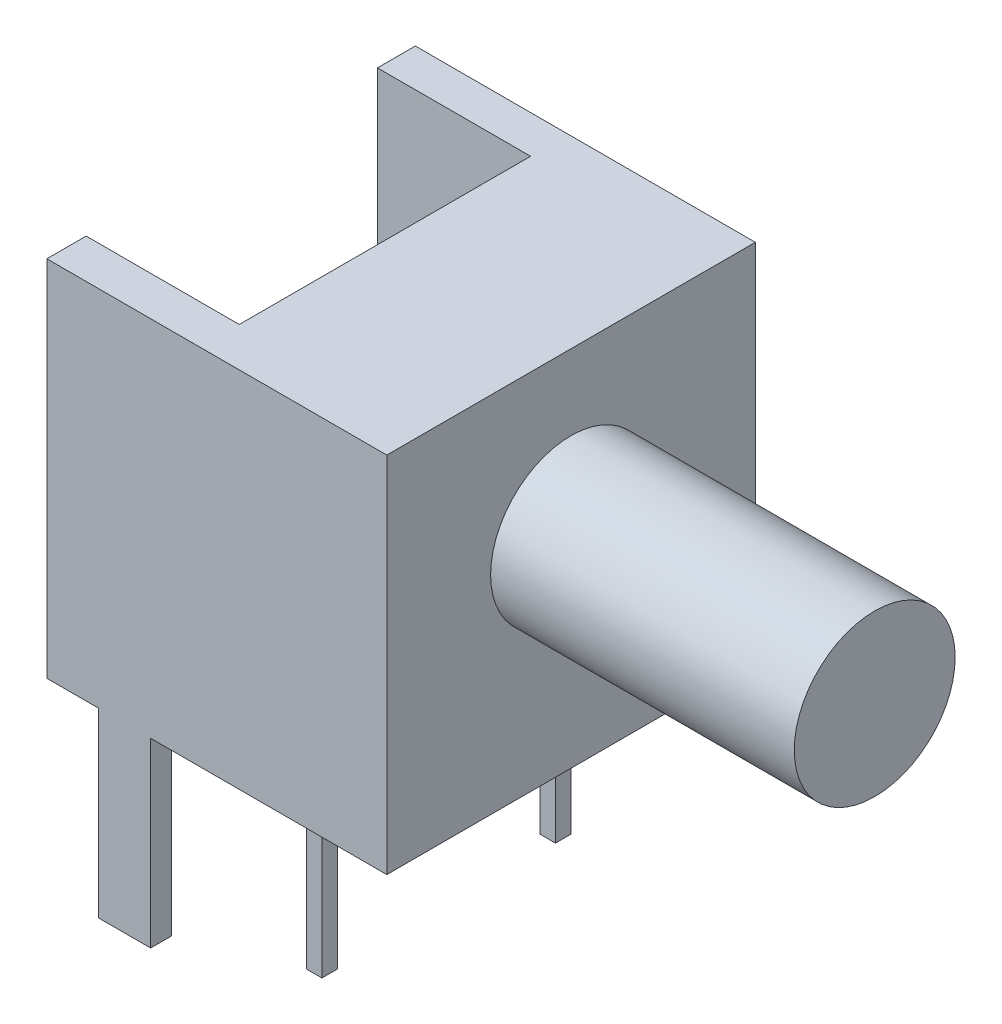
ISO-10303-21;
HEADER;
FILE_DESCRIPTION(('STEP AP214'),'2;1');
FILE_NAME('part.step','',(''),(''),'','','');
FILE_SCHEMA(('AUTOMOTIVE_DESIGN { 1 0 10303 214 1 1 1 1 }'));
ENDSEC;
DATA;
#1=APPLICATION_CONTEXT('core data for automotive mechanical design processes');
#2=APPLICATION_PROTOCOL_DEFINITION('international standard','automotive_design',2000,#1);
#3=PRODUCT_CONTEXT('',#1,'mechanical');
#4=PRODUCT('Part','Part','',(#3));
#5=PRODUCT_RELATED_PRODUCT_CATEGORY('part','',(#4));
#6=PRODUCT_DEFINITION_FORMATION('','',#4);
#7=PRODUCT_DEFINITION_CONTEXT('part definition',#1,'design');
#8=PRODUCT_DEFINITION('design','',#6,#7);
#9=PRODUCT_DEFINITION_SHAPE('','',#8);
#10=(LENGTH_UNIT() NAMED_UNIT(*) SI_UNIT(.MILLI.,.METRE.));
#11=(NAMED_UNIT(*) PLANE_ANGLE_UNIT() SI_UNIT($,.RADIAN.));
#12=(NAMED_UNIT(*) SI_UNIT($,.STERADIAN.) SOLID_ANGLE_UNIT());
#13=UNCERTAINTY_MEASURE_WITH_UNIT(LENGTH_MEASURE(1.E-05),#10,'distance_accuracy_value','');
#14=(GEOMETRIC_REPRESENTATION_CONTEXT(3) GLOBAL_UNCERTAINTY_ASSIGNED_CONTEXT((#13)) GLOBAL_UNIT_ASSIGNED_CONTEXT((#10,
#11,#12)) REPRESENTATION_CONTEXT('',''));
#15=CARTESIAN_POINT('',(0.,0.,0.));
#16=DIRECTION('',(0.,0.,1.));
#17=DIRECTION('',(1.,0.,0.));
#18=AXIS2_PLACEMENT_3D('',#15,#16,#17);
#19=CARTESIAN_POINT('',(0.,3.5,-3.55));
#20=DIRECTION('',(-1.,0.,0.));
#21=DIRECTION('',(0.,0.,1.));
#22=AXIS2_PLACEMENT_3D('',#19,#20,#21);
#23=PLANE('',#22);
#24=DIRECTION('',(0.,1.,0.));
#25=VECTOR('',#24,1.);
#26=CARTESIAN_POINT('',(0.,-3.5,-3.55));
#27=LINE('',#26,#25);
#28=CARTESIAN_POINT('',(0.,-3.5,-3.55));
#29=VERTEX_POINT('',#28);
#30=CARTESIAN_POINT('',(0.,3.5,-3.55));
#31=VERTEX_POINT('',#30);
#32=EDGE_CURVE('E229',#29,#31,#27,.T.);
#33=ORIENTED_EDGE('',*,*,#32,.T.);
#34=DIRECTION('',(0.,0.,1.));
#35=VECTOR('',#34,1.);
#36=CARTESIAN_POINT('',(0.,3.5,3.55));
#37=LINE('',#36,#35);
#38=CARTESIAN_POINT('',(0.,3.5,3.55));
#39=VERTEX_POINT('',#38);
#40=EDGE_CURVE('E232',#31,#39,#37,.T.);
#41=ORIENTED_EDGE('',*,*,#40,.T.);
#42=DIRECTION('',(0.,-1.,0.));
#43=VECTOR('',#42,1.);
#44=CARTESIAN_POINT('',(0.,-3.5,3.55));
#45=LINE('',#44,#43);
#46=CARTESIAN_POINT('',(0.,-3.5,3.55));
#47=VERTEX_POINT('',#46);
#48=EDGE_CURVE('E236',#39,#47,#45,.T.);
#49=ORIENTED_EDGE('',*,*,#48,.T.);
#50=DIRECTION('',(0.,0.,-1.));
#51=VECTOR('',#50,1.);
#52=CARTESIAN_POINT('',(0.,-3.5,3.55));
#53=LINE('',#52,#51);
#54=EDGE_CURVE('E220',#47,#29,#53,.T.);
#55=ORIENTED_EDGE('',*,*,#54,.T.);
#56=EDGE_LOOP('',(#33,#41,#49,#55));
#57=FACE_BOUND('',#56,.T.);
#58=CARTESIAN_POINT('',(0.,0.500000000000001,0.));
#59=DIRECTION('',(-1.,0.,0.));
#60=DIRECTION('',(0.,0.,1.));
#61=AXIS2_PLACEMENT_3D('',#58,#59,#60);
#62=CIRCLE('',#61,1.55);
#63=CARTESIAN_POINT('',(0.,0.500000000000001,1.55));
#64=VERTEX_POINT('',#63);
#65=EDGE_CURVE('E11',#64,#64,#62,.F.);
#66=ORIENTED_EDGE('',*,*,#65,.F.);
#67=EDGE_LOOP('',(#66));
#68=FACE_BOUND('',#67,.T.);
#69=ADVANCED_FACE('F31',(#57,#68),#23,.F.);
#70=CARTESIAN_POINT('',(-6.55,3.5,-3.55));
#71=DIRECTION('',(-1.,0.,0.));
#72=DIRECTION('',(0.,0.,1.));
#73=AXIS2_PLACEMENT_3D('',#70,#71,#72);
#74=PLANE('',#73);
#75=DIRECTION('',(0.,-1.,0.));
#76=VECTOR('',#75,1.);
#77=CARTESIAN_POINT('',(-6.55,3.5,-2.82011053729075));
#78=LINE('',#77,#76);
#79=CARTESIAN_POINT('',(-6.55,3.5,-2.82011053729075));
#80=VERTEX_POINT('',#79);
#81=CARTESIAN_POINT('',(-6.55,-3.5,-2.82011053729075));
#82=VERTEX_POINT('',#81);
#83=EDGE_CURVE('E39',#80,#82,#78,.T.);
#84=ORIENTED_EDGE('',*,*,#83,.F.);
#85=DIRECTION('',(0.,0.,1.));
#86=VECTOR('',#85,1.);
#87=CARTESIAN_POINT('',(-6.55,3.5,3.55));
#88=LINE('',#87,#86);
#89=CARTESIAN_POINT('',(-6.55,3.5,-3.55));
#90=VERTEX_POINT('',#89);
#91=EDGE_CURVE('E215',#90,#80,#88,.T.);
#92=ORIENTED_EDGE('',*,*,#91,.F.);
#93=DIRECTION('',(0.,1.,0.));
#94=VECTOR('',#93,1.);
#95=CARTESIAN_POINT('',(-6.55,-3.5,-3.55));
#96=LINE('',#95,#94);
#97=CARTESIAN_POINT('',(-6.55,-3.5,-3.55));
#98=VERTEX_POINT('',#97);
#99=EDGE_CURVE('E216',#98,#90,#96,.T.);
#100=ORIENTED_EDGE('',*,*,#99,.F.);
#101=DIRECTION('',(0.,0.,-1.));
#102=VECTOR('',#101,1.);
#103=CARTESIAN_POINT('',(-6.55,-3.5,3.55));
#104=LINE('',#103,#102);
#105=EDGE_CURVE('E225',#82,#98,#104,.T.);
#106=ORIENTED_EDGE('',*,*,#105,.F.);
#107=EDGE_LOOP('',(#84,#92,#100,#106));
#108=FACE_BOUND('',#107,.T.);
#109=ADVANCED_FACE('F279',(#108),#74,.T.);
#110=CARTESIAN_POINT('',(-6.55,-3.5,3.55));
#111=DIRECTION('',(0.,-1.,0.));
#112=DIRECTION('',(0.,0.,-1.));
#113=AXIS2_PLACEMENT_3D('',#110,#111,#112);
#114=PLANE('',#113);
#115=DIRECTION('',(1.,0.,0.));
#116=VECTOR('',#115,1.);
#117=CARTESIAN_POINT('',(-6.55,-3.5,-2.82011053729075));
#118=LINE('',#117,#116);
#119=CARTESIAN_POINT('',(-3.6,-3.5,-2.82011053729075));
#120=VERTEX_POINT('',#119);
#121=EDGE_CURVE('E400',#82,#120,#118,.T.);
#122=ORIENTED_EDGE('',*,*,#121,.F.);
#123=ORIENTED_EDGE('',*,*,#105,.T.);
#124=DIRECTION('',(1.,0.,0.));
#125=VECTOR('',#124,1.);
#126=CARTESIAN_POINT('',(-6.55,-3.5,-3.55));
#127=LINE('',#126,#125);
#128=CARTESIAN_POINT('',(-5.55,-3.5,-3.55));
#129=VERTEX_POINT('',#128);
#130=EDGE_CURVE('E200',#98,#129,#127,.T.);
#131=ORIENTED_EDGE('',*,*,#130,.T.);
#132=DIRECTION('',(0.,0.,1.));
#133=VECTOR('',#132,1.);
#134=CARTESIAN_POINT('',(-5.55,-3.5,-3.15));
#135=LINE('',#134,#133);
#136=CARTESIAN_POINT('',(-5.55,-3.5,-3.15));
#137=VERTEX_POINT('',#136);
#138=EDGE_CURVE('E438',#129,#137,#135,.T.);
#139=ORIENTED_EDGE('',*,*,#138,.T.);
#140=DIRECTION('',(1.,0.,0.));
#141=VECTOR('',#140,1.);
#142=CARTESIAN_POINT('',(-5.55,-3.5,-3.15));
#143=LINE('',#142,#141);
#144=CARTESIAN_POINT('',(-4.55,-3.5,-3.15));
#145=VERTEX_POINT('',#144);
#146=EDGE_CURVE('E449',#137,#145,#143,.T.);
#147=ORIENTED_EDGE('',*,*,#146,.T.);
#148=DIRECTION('',(0.,0.,-1.));
#149=VECTOR('',#148,1.);
#150=CARTESIAN_POINT('',(-4.55,-3.5,-3.15));
#151=LINE('',#150,#149);
#152=CARTESIAN_POINT('',(-4.55,-3.5,-3.55));
#153=VERTEX_POINT('',#152);
#154=EDGE_CURVE('E271',#145,#153,#151,.T.);
#155=ORIENTED_EDGE('',*,*,#154,.T.);
#156=EDGE_CURVE('E242',#153,#29,#127,.T.);
#157=ORIENTED_EDGE('',*,*,#156,.T.);
#158=ORIENTED_EDGE('',*,*,#54,.F.);
#159=DIRECTION('',(1.,0.,0.));
#160=VECTOR('',#159,1.);
#161=CARTESIAN_POINT('',(-6.55,-3.5,3.55));
#162=LINE('',#161,#160);
#163=CARTESIAN_POINT('',(-4.55,-3.5,3.55));
#164=VERTEX_POINT('',#163);
#165=EDGE_CURVE('E249',#164,#47,#162,.T.);
#166=ORIENTED_EDGE('',*,*,#165,.F.);
#167=DIRECTION('',(0.,0.,1.));
#168=VECTOR('',#167,1.);
#169=CARTESIAN_POINT('',(-4.55,-3.5,3.15));
#170=LINE('',#169,#168);
#171=CARTESIAN_POINT('',(-4.55,-3.5,3.15));
#172=VERTEX_POINT('',#171);
#173=EDGE_CURVE('E491',#172,#164,#170,.T.);
#174=ORIENTED_EDGE('',*,*,#173,.F.);
#175=DIRECTION('',(1.,0.,0.));
#176=VECTOR('',#175,1.);
#177=CARTESIAN_POINT('',(-5.55,-3.5,3.15));
#178=LINE('',#177,#176);
#179=CARTESIAN_POINT('',(-5.55,-3.5,3.15));
#180=VERTEX_POINT('',#179);
#181=EDGE_CURVE('E496',#180,#172,#178,.T.);
#182=ORIENTED_EDGE('',*,*,#181,.F.);
#183=DIRECTION('',(0.,0.,-1.));
#184=VECTOR('',#183,1.);
#185=CARTESIAN_POINT('',(-5.55,-3.5,3.15));
#186=LINE('',#185,#184);
#187=CARTESIAN_POINT('',(-5.55,-3.5,3.55));
#188=VERTEX_POINT('',#187);
#189=EDGE_CURVE('E508',#188,#180,#186,.T.);
#190=ORIENTED_EDGE('',*,*,#189,.F.);
#191=CARTESIAN_POINT('',(-6.55,-3.5,3.55));
#192=VERTEX_POINT('',#191);
#193=EDGE_CURVE('E252',#192,#188,#162,.T.);
#194=ORIENTED_EDGE('',*,*,#193,.F.);
#195=CARTESIAN_POINT('',(-6.55,-3.5,2.79237595071638));
#196=VERTEX_POINT('',#195);
#197=EDGE_CURVE('E226',#192,#196,#104,.T.);
#198=ORIENTED_EDGE('',*,*,#197,.T.);
#199=DIRECTION('',(-1.,0.,0.));
#200=VECTOR('',#199,1.);
#201=CARTESIAN_POINT('',(-6.55,-3.5,2.79237595071638));
#202=LINE('',#201,#200);
#203=CARTESIAN_POINT('',(-3.6,-3.5,2.79237595071638));
#204=VERTEX_POINT('',#203);
#205=EDGE_CURVE('E46',#204,#196,#202,.T.);
#206=ORIENTED_EDGE('',*,*,#205,.F.);
#207=DIRECTION('',(0.,0.,1.));
#208=VECTOR('',#207,1.);
#209=CARTESIAN_POINT('',(-3.6,-3.5,3.55));
#210=LINE('',#209,#208);
#211=EDGE_CURVE('E402',#120,#204,#210,.T.);
#212=ORIENTED_EDGE('',*,*,#211,.F.);
#213=EDGE_LOOP('',(#122,#123,#131,#139,#147,#155,#157,#158,#166,#174,#182,#190,#194,#198,#206,#212));
#214=FACE_BOUND('',#213,.T.);
#215=DIRECTION('',(0.,0.,-1.));
#216=VECTOR('',#215,1.);
#217=CARTESIAN_POINT('',(-2.4,-3.5,-2.4));
#218=LINE('',#217,#216);
#219=CARTESIAN_POINT('',(-2.4,-3.5,-2.1));
#220=VERTEX_POINT('',#219);
#221=CARTESIAN_POINT('',(-2.4,-3.5,-2.4));
#222=VERTEX_POINT('',#221);
#223=EDGE_CURVE('E404',#220,#222,#218,.T.);
#224=ORIENTED_EDGE('',*,*,#223,.T.);
#225=DIRECTION('',(-1.,0.,0.));
#226=VECTOR('',#225,1.);
#227=CARTESIAN_POINT('',(-2.7,-3.5,-2.4));
#228=LINE('',#227,#226);
#229=CARTESIAN_POINT('',(-2.7,-3.5,-2.4));
#230=VERTEX_POINT('',#229);
#231=EDGE_CURVE('E409',#222,#230,#228,.T.);
#232=ORIENTED_EDGE('',*,*,#231,.T.);
#233=DIRECTION('',(0.,0.,1.));
#234=VECTOR('',#233,1.);
#235=CARTESIAN_POINT('',(-2.7,-3.5,-2.4));
#236=LINE('',#235,#234);
#237=CARTESIAN_POINT('',(-2.7,-3.5,-2.1));
#238=VERTEX_POINT('',#237);
#239=EDGE_CURVE('E421',#230,#238,#236,.T.);
#240=ORIENTED_EDGE('',*,*,#239,.T.);
#241=DIRECTION('',(1.,0.,0.));
#242=VECTOR('',#241,1.);
#243=CARTESIAN_POINT('',(-2.7,-3.5,-2.1));
#244=LINE('',#243,#242);
#245=EDGE_CURVE('E54',#238,#220,#244,.T.);
#246=ORIENTED_EDGE('',*,*,#245,.T.);
#247=EDGE_LOOP('',(#224,#232,#240,#246));
#248=FACE_BOUND('',#247,.T.);
#249=DIRECTION('',(-1.,0.,0.));
#250=VECTOR('',#249,1.);
#251=CARTESIAN_POINT('',(-2.7,-3.5,2.4));
#252=LINE('',#251,#250);
#253=CARTESIAN_POINT('',(-2.4,-3.5,2.4));
#254=VERTEX_POINT('',#253);
#255=CARTESIAN_POINT('',(-2.7,-3.5,2.4));
#256=VERTEX_POINT('',#255);
#257=EDGE_CURVE('E476',#254,#256,#252,.T.);
#258=ORIENTED_EDGE('',*,*,#257,.F.);
#259=DIRECTION('',(0.,0.,1.));
#260=VECTOR('',#259,1.);
#261=CARTESIAN_POINT('',(-2.4,-3.5,2.4));
#262=LINE('',#261,#260);
#263=CARTESIAN_POINT('',(-2.4,-3.5,2.1));
#264=VERTEX_POINT('',#263);
#265=EDGE_CURVE('E462',#264,#254,#262,.T.);
#266=ORIENTED_EDGE('',*,*,#265,.F.);
#267=DIRECTION('',(1.,0.,0.));
#268=VECTOR('',#267,1.);
#269=CARTESIAN_POINT('',(-2.7,-3.5,2.1));
#270=LINE('',#269,#268);
#271=CARTESIAN_POINT('',(-2.7,-3.5,2.1));
#272=VERTEX_POINT('',#271);
#273=EDGE_CURVE('E467',#272,#264,#270,.T.);
#274=ORIENTED_EDGE('',*,*,#273,.F.);
#275=DIRECTION('',(0.,0.,-1.));
#276=VECTOR('',#275,1.);
#277=CARTESIAN_POINT('',(-2.7,-3.5,2.4));
#278=LINE('',#277,#276);
#279=EDGE_CURVE('E478',#256,#272,#278,.T.);
#280=ORIENTED_EDGE('',*,*,#279,.F.);
#281=EDGE_LOOP('',(#258,#266,#274,#280));
#282=FACE_BOUND('',#281,.T.);
#283=ADVANCED_FACE('F268',(#214,#248,#282),#114,.T.);
#284=CARTESIAN_POINT('',(-6.55,-3.5,-3.55));
#285=DIRECTION('',(0.,0.,-1.));
#286=DIRECTION('',(-1.,0.,0.));
#287=AXIS2_PLACEMENT_3D('',#284,#285,#286);
#288=PLANE('',#287);
#289=ORIENTED_EDGE('',*,*,#32,.F.);
#290=ORIENTED_EDGE('',*,*,#156,.F.);
#291=DIRECTION('',(0.,1.,0.));
#292=VECTOR('',#291,1.);
#293=CARTESIAN_POINT('',(-4.55,-7.,-3.55));
#294=LINE('',#293,#292);
#295=CARTESIAN_POINT('',(-4.55,-7.,-3.55));
#296=VERTEX_POINT('',#295);
#297=EDGE_CURVE('E447',#296,#153,#294,.T.);
#298=ORIENTED_EDGE('',*,*,#297,.F.);
#299=DIRECTION('',(-1.,0.,0.));
#300=VECTOR('',#299,1.);
#301=CARTESIAN_POINT('',(-5.55,-7.,-3.55));
#302=LINE('',#301,#300);
#303=CARTESIAN_POINT('',(-5.55,-7.,-3.55));
#304=VERTEX_POINT('',#303);
#305=EDGE_CURVE('E444',#296,#304,#302,.T.);
#306=ORIENTED_EDGE('',*,*,#305,.T.);
#307=DIRECTION('',(0.,1.,0.));
#308=VECTOR('',#307,1.);
#309=CARTESIAN_POINT('',(-5.55,-7.,-3.55));
#310=LINE('',#309,#308);
#311=EDGE_CURVE('E453',#304,#129,#310,.T.);
#312=ORIENTED_EDGE('',*,*,#311,.T.);
#313=ORIENTED_EDGE('',*,*,#130,.F.);
#314=ORIENTED_EDGE('',*,*,#99,.T.);
#315=DIRECTION('',(1.,0.,0.));
#316=VECTOR('',#315,1.);
#317=CARTESIAN_POINT('',(-6.55,3.5,-3.55));
#318=LINE('',#317,#316);
#319=EDGE_CURVE('E228',#90,#31,#318,.T.);
#320=ORIENTED_EDGE('',*,*,#319,.T.);
#321=EDGE_LOOP('',(#289,#290,#298,#306,#312,#313,#314,#320));
#322=FACE_BOUND('',#321,.T.);
#323=ADVANCED_FACE('F33',(#322),#288,.T.);
#324=CARTESIAN_POINT('',(-6.55,-3.5,3.55));
#325=DIRECTION('',(0.,0.,1.));
#326=DIRECTION('',(1.,0.,0.));
#327=AXIS2_PLACEMENT_3D('',#324,#325,#326);
#328=PLANE('',#327);
#329=ORIENTED_EDGE('',*,*,#48,.F.);
#330=DIRECTION('',(1.,0.,0.));
#331=VECTOR('',#330,1.);
#332=CARTESIAN_POINT('',(-6.55,3.5,3.55));
#333=LINE('',#332,#331);
#334=CARTESIAN_POINT('',(-6.55,3.5,3.55));
#335=VERTEX_POINT('',#334);
#336=EDGE_CURVE('E245',#335,#39,#333,.T.);
#337=ORIENTED_EDGE('',*,*,#336,.F.);
#338=DIRECTION('',(0.,-1.,0.));
#339=VECTOR('',#338,1.);
#340=CARTESIAN_POINT('',(-6.55,-3.5,3.55));
#341=LINE('',#340,#339);
#342=EDGE_CURVE('E214',#335,#192,#341,.T.);
#343=ORIENTED_EDGE('',*,*,#342,.T.);
#344=ORIENTED_EDGE('',*,*,#193,.T.);
#345=DIRECTION('',(0.,1.,0.));
#346=VECTOR('',#345,1.);
#347=CARTESIAN_POINT('',(-5.55,-7.,3.55));
#348=LINE('',#347,#346);
#349=CARTESIAN_POINT('',(-5.55,-7.,3.55));
#350=VERTEX_POINT('',#349);
#351=EDGE_CURVE('E527',#350,#188,#348,.T.);
#352=ORIENTED_EDGE('',*,*,#351,.F.);
#353=DIRECTION('',(-1.,0.,0.));
#354=VECTOR('',#353,1.);
#355=CARTESIAN_POINT('',(-5.55,-7.,3.55));
#356=LINE('',#355,#354);
#357=CARTESIAN_POINT('',(-4.55,-7.,3.55));
#358=VERTEX_POINT('',#357);
#359=EDGE_CURVE('E495',#358,#350,#356,.T.);
#360=ORIENTED_EDGE('',*,*,#359,.F.);
#361=DIRECTION('',(0.,1.,0.));
#362=VECTOR('',#361,1.);
#363=CARTESIAN_POINT('',(-4.55,-7.,3.55));
#364=LINE('',#363,#362);
#365=EDGE_CURVE('E233',#358,#164,#364,.T.);
#366=ORIENTED_EDGE('',*,*,#365,.T.);
#367=ORIENTED_EDGE('',*,*,#165,.T.);
#368=EDGE_LOOP('',(#329,#337,#343,#344,#352,#360,#366,#367));
#369=FACE_BOUND('',#368,.T.);
#370=ADVANCED_FACE('F260',(#369),#328,.T.);
#371=CARTESIAN_POINT('',(-6.55,3.5,3.55));
#372=DIRECTION('',(0.,1.,0.));
#373=DIRECTION('',(0.,0.,1.));
#374=AXIS2_PLACEMENT_3D('',#371,#372,#373);
#375=PLANE('',#374);
#376=DIRECTION('',(-1.,0.,0.));
#377=VECTOR('',#376,1.);
#378=CARTESIAN_POINT('',(-6.55,3.5,-2.82011053729075));
#379=LINE('',#378,#377);
#380=CARTESIAN_POINT('',(-3.6,3.5,-2.82011053729075));
#381=VERTEX_POINT('',#380);
#382=EDGE_CURVE('E393',#381,#80,#379,.T.);
#383=ORIENTED_EDGE('',*,*,#382,.F.);
#384=DIRECTION('',(0.,0.,-1.));
#385=VECTOR('',#384,1.);
#386=CARTESIAN_POINT('',(-3.6,3.5,-2.82011053729075));
#387=LINE('',#386,#385);
#388=CARTESIAN_POINT('',(-3.6,3.5,2.79237595071638));
#389=VERTEX_POINT('',#388);
#390=EDGE_CURVE('E208',#389,#381,#387,.T.);
#391=ORIENTED_EDGE('',*,*,#390,.F.);
#392=DIRECTION('',(1.,0.,0.));
#393=VECTOR('',#392,1.);
#394=CARTESIAN_POINT('',(-6.55,3.5,2.79237595071638));
#395=LINE('',#394,#393);
#396=CARTESIAN_POINT('',(-6.55,3.5,2.79237595071638));
#397=VERTEX_POINT('',#396);
#398=EDGE_CURVE('E194',#397,#389,#395,.T.);
#399=ORIENTED_EDGE('',*,*,#398,.F.);
#400=EDGE_CURVE('E205',#397,#335,#88,.T.);
#401=ORIENTED_EDGE('',*,*,#400,.T.);
#402=ORIENTED_EDGE('',*,*,#336,.T.);
#403=ORIENTED_EDGE('',*,*,#40,.F.);
#404=ORIENTED_EDGE('',*,*,#319,.F.);
#405=ORIENTED_EDGE('',*,*,#91,.T.);
#406=EDGE_LOOP('',(#383,#391,#399,#401,#402,#403,#404,#405));
#407=FACE_BOUND('',#406,.T.);
#408=ADVANCED_FACE('F204',(#407),#375,.T.);
#409=DIRECTION('',(0.,1.,0.));
#410=VECTOR('',#409,1.);
#411=CARTESIAN_POINT('',(-6.55,3.5,2.79237595071638));
#412=LINE('',#411,#410);
#413=EDGE_CURVE('E191',#196,#397,#412,.T.);
#414=ORIENTED_EDGE('',*,*,#413,.F.);
#415=ORIENTED_EDGE('',*,*,#197,.F.);
#416=ORIENTED_EDGE('',*,*,#342,.F.);
#417=ORIENTED_EDGE('',*,*,#400,.F.);
#418=EDGE_LOOP('',(#414,#415,#416,#417));
#419=FACE_BOUND('',#418,.T.);
#420=ADVANCED_FACE('F212',(#419),#74,.T.);
#421=CARTESIAN_POINT('',(-4.55,-7.,3.15));
#422=DIRECTION('',(-1.,0.,0.));
#423=DIRECTION('',(0.,0.,1.));
#424=AXIS2_PLACEMENT_3D('',#421,#422,#423);
#425=PLANE('',#424);
#426=ORIENTED_EDGE('',*,*,#173,.T.);
#427=ORIENTED_EDGE('',*,*,#365,.F.);
#428=DIRECTION('',(0.,0.,1.));
#429=VECTOR('',#428,1.);
#430=CARTESIAN_POINT('',(-4.55,-7.,3.15));
#431=LINE('',#430,#429);
#432=CARTESIAN_POINT('',(-4.55,-7.,3.15));
#433=VERTEX_POINT('',#432);
#434=EDGE_CURVE('E492',#433,#358,#431,.T.);
#435=ORIENTED_EDGE('',*,*,#434,.F.);
#436=DIRECTION('',(0.,1.,0.));
#437=VECTOR('',#436,1.);
#438=CARTESIAN_POINT('',(-4.55,-7.,3.15));
#439=LINE('',#438,#437);
#440=EDGE_CURVE('E502',#433,#172,#439,.T.);
#441=ORIENTED_EDGE('',*,*,#440,.T.);
#442=EDGE_LOOP('',(#426,#427,#435,#441));
#443=FACE_BOUND('',#442,.T.);
#444=ADVANCED_FACE('F293',(#443),#425,.F.);
#445=CARTESIAN_POINT('',(-5.55,-7.,3.15));
#446=DIRECTION('',(1.,0.,0.));
#447=DIRECTION('',(0.,0.,-1.));
#448=AXIS2_PLACEMENT_3D('',#445,#446,#447);
#449=PLANE('',#448);
#450=ORIENTED_EDGE('',*,*,#189,.T.);
#451=DIRECTION('',(0.,1.,0.));
#452=VECTOR('',#451,1.);
#453=CARTESIAN_POINT('',(-5.55,-7.,3.15));
#454=LINE('',#453,#452);
#455=CARTESIAN_POINT('',(-5.55,-7.,3.15));
#456=VERTEX_POINT('',#455);
#457=EDGE_CURVE('E531',#456,#180,#454,.T.);
#458=ORIENTED_EDGE('',*,*,#457,.F.);
#459=DIRECTION('',(0.,0.,-1.));
#460=VECTOR('',#459,1.);
#461=CARTESIAN_POINT('',(-5.55,-7.,3.15));
#462=LINE('',#461,#460);
#463=EDGE_CURVE('E498',#350,#456,#462,.T.);
#464=ORIENTED_EDGE('',*,*,#463,.F.);
#465=ORIENTED_EDGE('',*,*,#351,.T.);
#466=EDGE_LOOP('',(#450,#458,#464,#465));
#467=FACE_BOUND('',#466,.T.);
#468=ADVANCED_FACE('F297',(#467),#449,.F.);
#469=CARTESIAN_POINT('',(-5.55,-7.,3.15));
#470=DIRECTION('',(0.,0.,1.));
#471=DIRECTION('',(1.,0.,0.));
#472=AXIS2_PLACEMENT_3D('',#469,#470,#471);
#473=PLANE('',#472);
#474=ORIENTED_EDGE('',*,*,#181,.T.);
#475=ORIENTED_EDGE('',*,*,#440,.F.);
#476=DIRECTION('',(1.,0.,0.));
#477=VECTOR('',#476,1.);
#478=CARTESIAN_POINT('',(-5.55,-7.,3.15));
#479=LINE('',#478,#477);
#480=EDGE_CURVE('E500',#456,#433,#479,.T.);
#481=ORIENTED_EDGE('',*,*,#480,.F.);
#482=ORIENTED_EDGE('',*,*,#457,.T.);
#483=EDGE_LOOP('',(#474,#475,#481,#482));
#484=FACE_BOUND('',#483,.T.);
#485=ADVANCED_FACE('F302',(#484),#473,.F.);
#486=CARTESIAN_POINT('',(-4.55,-7.,3.55));
#487=DIRECTION('',(0.,1.,0.));
#488=DIRECTION('',(0.,0.,1.));
#489=AXIS2_PLACEMENT_3D('',#486,#487,#488);
#490=PLANE('',#489);
#491=ORIENTED_EDGE('',*,*,#434,.T.);
#492=ORIENTED_EDGE('',*,*,#359,.T.);
#493=ORIENTED_EDGE('',*,*,#463,.T.);
#494=ORIENTED_EDGE('',*,*,#480,.T.);
#495=EDGE_LOOP('',(#491,#492,#493,#494));
#496=FACE_BOUND('',#495,.T.);
#497=ADVANCED_FACE('F308',(#496),#490,.F.);
#498=CARTESIAN_POINT('',(-2.4,-7.,2.4));
#499=DIRECTION('',(-1.,0.,0.));
#500=DIRECTION('',(0.,0.,1.));
#501=AXIS2_PLACEMENT_3D('',#498,#499,#500);
#502=PLANE('',#501);
#503=ORIENTED_EDGE('',*,*,#265,.T.);
#504=DIRECTION('',(0.,1.,0.));
#505=VECTOR('',#504,1.);
#506=CARTESIAN_POINT('',(-2.4,-7.,2.4));
#507=LINE('',#506,#505);
#508=CARTESIAN_POINT('',(-2.4,-7.,2.4));
#509=VERTEX_POINT('',#508);
#510=EDGE_CURVE('E489',#509,#254,#507,.T.);
#511=ORIENTED_EDGE('',*,*,#510,.F.);
#512=DIRECTION('',(0.,0.,1.));
#513=VECTOR('',#512,1.);
#514=CARTESIAN_POINT('',(-2.4,-7.,2.4));
#515=LINE('',#514,#513);
#516=CARTESIAN_POINT('',(-2.4,-7.,2.1));
#517=VERTEX_POINT('',#516);
#518=EDGE_CURVE('E463',#517,#509,#515,.T.);
#519=ORIENTED_EDGE('',*,*,#518,.F.);
#520=DIRECTION('',(0.,1.,0.));
#521=VECTOR('',#520,1.);
#522=CARTESIAN_POINT('',(-2.4,-7.,2.1));
#523=LINE('',#522,#521);
#524=EDGE_CURVE('E473',#517,#264,#523,.T.);
#525=ORIENTED_EDGE('',*,*,#524,.T.);
#526=EDGE_LOOP('',(#503,#511,#519,#525));
#527=FACE_BOUND('',#526,.T.);
#528=ADVANCED_FACE('F312',(#527),#502,.F.);
#529=CARTESIAN_POINT('',(-2.7,-7.,2.4));
#530=DIRECTION('',(0.,0.,-1.));
#531=DIRECTION('',(-1.,0.,0.));
#532=AXIS2_PLACEMENT_3D('',#529,#530,#531);
#533=PLANE('',#532);
#534=ORIENTED_EDGE('',*,*,#257,.T.);
#535=DIRECTION('',(0.,1.,0.));
#536=VECTOR('',#535,1.);
#537=CARTESIAN_POINT('',(-2.7,-7.,2.4));
#538=LINE('',#537,#536);
#539=CARTESIAN_POINT('',(-2.7,-7.,2.4));
#540=VERTEX_POINT('',#539);
#541=EDGE_CURVE('E486',#540,#256,#538,.T.);
#542=ORIENTED_EDGE('',*,*,#541,.F.);
#543=DIRECTION('',(-1.,0.,0.));
#544=VECTOR('',#543,1.);
#545=CARTESIAN_POINT('',(-2.7,-7.,2.4));
#546=LINE('',#545,#544);
#547=EDGE_CURVE('E466',#509,#540,#546,.T.);
#548=ORIENTED_EDGE('',*,*,#547,.F.);
#549=ORIENTED_EDGE('',*,*,#510,.T.);
#550=EDGE_LOOP('',(#534,#542,#548,#549));
#551=FACE_BOUND('',#550,.T.);
#552=ADVANCED_FACE('F316',(#551),#533,.F.);
#553=CARTESIAN_POINT('',(-2.7,-7.,2.4));
#554=DIRECTION('',(1.,0.,0.));
#555=DIRECTION('',(0.,0.,-1.));
#556=AXIS2_PLACEMENT_3D('',#553,#554,#555);
#557=PLANE('',#556);
#558=ORIENTED_EDGE('',*,*,#279,.T.);
#559=DIRECTION('',(0.,1.,0.));
#560=VECTOR('',#559,1.);
#561=CARTESIAN_POINT('',(-2.7,-7.,2.1));
#562=LINE('',#561,#560);
#563=CARTESIAN_POINT('',(-2.7,-7.,2.1));
#564=VERTEX_POINT('',#563);
#565=EDGE_CURVE('E484',#564,#272,#562,.T.);
#566=ORIENTED_EDGE('',*,*,#565,.F.);
#567=DIRECTION('',(0.,0.,-1.));
#568=VECTOR('',#567,1.);
#569=CARTESIAN_POINT('',(-2.7,-7.,2.4));
#570=LINE('',#569,#568);
#571=EDGE_CURVE('E469',#540,#564,#570,.T.);
#572=ORIENTED_EDGE('',*,*,#571,.F.);
#573=ORIENTED_EDGE('',*,*,#541,.T.);
#574=EDGE_LOOP('',(#558,#566,#572,#573));
#575=FACE_BOUND('',#574,.T.);
#576=ADVANCED_FACE('F320',(#575),#557,.F.);
#577=CARTESIAN_POINT('',(-2.7,-7.,2.1));
#578=DIRECTION('',(0.,0.,1.));
#579=DIRECTION('',(1.,0.,0.));
#580=AXIS2_PLACEMENT_3D('',#577,#578,#579);
#581=PLANE('',#580);
#582=ORIENTED_EDGE('',*,*,#273,.T.);
#583=ORIENTED_EDGE('',*,*,#524,.F.);
#584=DIRECTION('',(1.,0.,0.));
#585=VECTOR('',#584,1.);
#586=CARTESIAN_POINT('',(-2.7,-7.,2.1));
#587=LINE('',#586,#585);
#588=EDGE_CURVE('E471',#564,#517,#587,.T.);
#589=ORIENTED_EDGE('',*,*,#588,.F.);
#590=ORIENTED_EDGE('',*,*,#565,.T.);
#591=EDGE_LOOP('',(#582,#583,#589,#590));
#592=FACE_BOUND('',#591,.T.);
#593=ADVANCED_FACE('F324',(#592),#581,.F.);
#594=CARTESIAN_POINT('',(-2.4,-7.,2.1));
#595=DIRECTION('',(0.,-1.,0.));
#596=DIRECTION('',(0.,0.,-1.));
#597=AXIS2_PLACEMENT_3D('',#594,#595,#596);
#598=PLANE('',#597);
#599=ORIENTED_EDGE('',*,*,#518,.T.);
#600=ORIENTED_EDGE('',*,*,#547,.T.);
#601=ORIENTED_EDGE('',*,*,#571,.T.);
#602=ORIENTED_EDGE('',*,*,#588,.T.);
#603=EDGE_LOOP('',(#599,#600,#601,#602));
#604=FACE_BOUND('',#603,.T.);
#605=ADVANCED_FACE('F328',(#604),#598,.T.);
#606=CARTESIAN_POINT('',(-4.55,-7.,-3.15));
#607=DIRECTION('',(1.,0.,0.));
#608=DIRECTION('',(0.,0.,-1.));
#609=AXIS2_PLACEMENT_3D('',#606,#607,#608);
#610=PLANE('',#609);
#611=ORIENTED_EDGE('',*,*,#154,.F.);
#612=DIRECTION('',(0.,1.,0.));
#613=VECTOR('',#612,1.);
#614=CARTESIAN_POINT('',(-4.55,-7.,-3.15));
#615=LINE('',#614,#613);
#616=CARTESIAN_POINT('',(-4.55,-7.,-3.15));
#617=VERTEX_POINT('',#616);
#618=EDGE_CURVE('E459',#617,#145,#615,.T.);
#619=ORIENTED_EDGE('',*,*,#618,.F.);
#620=DIRECTION('',(0.,0.,-1.));
#621=VECTOR('',#620,1.);
#622=CARTESIAN_POINT('',(-4.55,-7.,-3.15));
#623=LINE('',#622,#621);
#624=EDGE_CURVE('E434',#617,#296,#623,.T.);
#625=ORIENTED_EDGE('',*,*,#624,.T.);
#626=ORIENTED_EDGE('',*,*,#297,.T.);
#627=EDGE_LOOP('',(#611,#619,#625,#626));
#628=FACE_BOUND('',#627,.T.);
#629=ADVANCED_FACE('F332',(#628),#610,.T.);
#630=CARTESIAN_POINT('',(-5.55,-7.,-3.15));
#631=DIRECTION('',(0.,0.,1.));
#632=DIRECTION('',(1.,0.,0.));
#633=AXIS2_PLACEMENT_3D('',#630,#631,#632);
#634=PLANE('',#633);
#635=ORIENTED_EDGE('',*,*,#146,.F.);
#636=DIRECTION('',(0.,1.,0.));
#637=VECTOR('',#636,1.);
#638=CARTESIAN_POINT('',(-5.55,-7.,-3.15));
#639=LINE('',#638,#637);
#640=CARTESIAN_POINT('',(-5.55,-7.,-3.15));
#641=VERTEX_POINT('',#640);
#642=EDGE_CURVE('E456',#641,#137,#639,.T.);
#643=ORIENTED_EDGE('',*,*,#642,.F.);
#644=DIRECTION('',(1.,0.,0.));
#645=VECTOR('',#644,1.);
#646=CARTESIAN_POINT('',(-5.55,-7.,-3.15));
#647=LINE('',#646,#645);
#648=EDGE_CURVE('E437',#641,#617,#647,.T.);
#649=ORIENTED_EDGE('',*,*,#648,.T.);
#650=ORIENTED_EDGE('',*,*,#618,.T.);
#651=EDGE_LOOP('',(#635,#643,#649,#650));
#652=FACE_BOUND('',#651,.T.);
#653=ADVANCED_FACE('F336',(#652),#634,.T.);
#654=CARTESIAN_POINT('',(-5.55,-7.,-3.15));
#655=DIRECTION('',(-1.,0.,0.));
#656=DIRECTION('',(0.,0.,1.));
#657=AXIS2_PLACEMENT_3D('',#654,#655,#656);
#658=PLANE('',#657);
#659=ORIENTED_EDGE('',*,*,#138,.F.);
#660=ORIENTED_EDGE('',*,*,#311,.F.);
#661=DIRECTION('',(0.,0.,1.));
#662=VECTOR('',#661,1.);
#663=CARTESIAN_POINT('',(-5.55,-7.,-3.15));
#664=LINE('',#663,#662);
#665=EDGE_CURVE('E441',#304,#641,#664,.T.);
#666=ORIENTED_EDGE('',*,*,#665,.T.);
#667=ORIENTED_EDGE('',*,*,#642,.T.);
#668=EDGE_LOOP('',(#659,#660,#666,#667));
#669=FACE_BOUND('',#668,.T.);
#670=ADVANCED_FACE('F340',(#669),#658,.T.);
#671=CARTESIAN_POINT('',(-4.55,-7.,-3.55));
#672=DIRECTION('',(0.,1.,0.));
#673=DIRECTION('',(0.,0.,-1.));
#674=AXIS2_PLACEMENT_3D('',#671,#672,#673);
#675=PLANE('',#674);
#676=ORIENTED_EDGE('',*,*,#624,.F.);
#677=ORIENTED_EDGE('',*,*,#648,.F.);
#678=ORIENTED_EDGE('',*,*,#665,.F.);
#679=ORIENTED_EDGE('',*,*,#305,.F.);
#680=EDGE_LOOP('',(#676,#677,#678,#679));
#681=FACE_BOUND('',#680,.T.);
#682=ADVANCED_FACE('F344',(#681),#675,.F.);
#683=CARTESIAN_POINT('',(-2.4,-7.,-2.4));
#684=DIRECTION('',(1.,0.,0.));
#685=DIRECTION('',(0.,0.,-1.));
#686=AXIS2_PLACEMENT_3D('',#683,#684,#685);
#687=PLANE('',#686);
#688=ORIENTED_EDGE('',*,*,#223,.F.);
#689=DIRECTION('',(0.,1.,0.));
#690=VECTOR('',#689,1.);
#691=CARTESIAN_POINT('',(-2.4,-7.,-2.1));
#692=LINE('',#691,#690);
#693=CARTESIAN_POINT('',(-2.4,-7.,-2.1));
#694=VERTEX_POINT('',#693);
#695=EDGE_CURVE('E432',#694,#220,#692,.T.);
#696=ORIENTED_EDGE('',*,*,#695,.F.);
#697=DIRECTION('',(0.,0.,-1.));
#698=VECTOR('',#697,1.);
#699=CARTESIAN_POINT('',(-2.4,-7.,-2.4));
#700=LINE('',#699,#698);
#701=CARTESIAN_POINT('',(-2.4,-7.,-2.4));
#702=VERTEX_POINT('',#701);
#703=EDGE_CURVE('E405',#694,#702,#700,.T.);
#704=ORIENTED_EDGE('',*,*,#703,.T.);
#705=DIRECTION('',(0.,1.,0.));
#706=VECTOR('',#705,1.);
#707=CARTESIAN_POINT('',(-2.4,-7.,-2.4));
#708=LINE('',#707,#706);
#709=EDGE_CURVE('E418',#702,#222,#708,.T.);
#710=ORIENTED_EDGE('',*,*,#709,.T.);
#711=EDGE_LOOP('',(#688,#696,#704,#710));
#712=FACE_BOUND('',#711,.T.);
#713=ADVANCED_FACE('F348',(#712),#687,.T.);
#714=CARTESIAN_POINT('',(-2.7,-7.,-2.1));
#715=DIRECTION('',(0.,0.,1.));
#716=DIRECTION('',(1.,0.,0.));
#717=AXIS2_PLACEMENT_3D('',#714,#715,#716);
#718=PLANE('',#717);
#719=ORIENTED_EDGE('',*,*,#245,.F.);
#720=DIRECTION('',(0.,1.,0.));
#721=VECTOR('',#720,1.);
#722=CARTESIAN_POINT('',(-2.7,-7.,-2.1));
#723=LINE('',#722,#721);
#724=CARTESIAN_POINT('',(-2.7,-7.,-2.1));
#725=VERTEX_POINT('',#724);
#726=EDGE_CURVE('E429',#725,#238,#723,.T.);
#727=ORIENTED_EDGE('',*,*,#726,.F.);
#728=DIRECTION('',(1.,0.,0.));
#729=VECTOR('',#728,1.);
#730=CARTESIAN_POINT('',(-2.7,-7.,-2.1));
#731=LINE('',#730,#729);
#732=EDGE_CURVE('E408',#725,#694,#731,.T.);
#733=ORIENTED_EDGE('',*,*,#732,.T.);
#734=ORIENTED_EDGE('',*,*,#695,.T.);
#735=EDGE_LOOP('',(#719,#727,#733,#734));
#736=FACE_BOUND('',#735,.T.);
#737=ADVANCED_FACE('F352',(#736),#718,.T.);
#738=CARTESIAN_POINT('',(-2.7,-7.,-2.4));
#739=DIRECTION('',(-1.,0.,0.));
#740=DIRECTION('',(0.,0.,1.));
#741=AXIS2_PLACEMENT_3D('',#738,#739,#740);
#742=PLANE('',#741);
#743=ORIENTED_EDGE('',*,*,#239,.F.);
#744=DIRECTION('',(0.,1.,0.));
#745=VECTOR('',#744,1.);
#746=CARTESIAN_POINT('',(-2.7,-7.,-2.4));
#747=LINE('',#746,#745);
#748=CARTESIAN_POINT('',(-2.7,-7.,-2.4));
#749=VERTEX_POINT('',#748);
#750=EDGE_CURVE('E426',#749,#230,#747,.T.);
#751=ORIENTED_EDGE('',*,*,#750,.F.);
#752=DIRECTION('',(0.,0.,1.));
#753=VECTOR('',#752,1.);
#754=CARTESIAN_POINT('',(-2.7,-7.,-2.4));
#755=LINE('',#754,#753);
#756=EDGE_CURVE('E412',#749,#725,#755,.T.);
#757=ORIENTED_EDGE('',*,*,#756,.T.);
#758=ORIENTED_EDGE('',*,*,#726,.T.);
#759=EDGE_LOOP('',(#743,#751,#757,#758));
#760=FACE_BOUND('',#759,.T.);
#761=ADVANCED_FACE('F356',(#760),#742,.T.);
#762=CARTESIAN_POINT('',(-2.7,-7.,-2.4));
#763=DIRECTION('',(0.,0.,-1.));
#764=DIRECTION('',(-1.,0.,0.));
#765=AXIS2_PLACEMENT_3D('',#762,#763,#764);
#766=PLANE('',#765);
#767=ORIENTED_EDGE('',*,*,#231,.F.);
#768=ORIENTED_EDGE('',*,*,#709,.F.);
#769=DIRECTION('',(-1.,0.,0.));
#770=VECTOR('',#769,1.);
#771=CARTESIAN_POINT('',(-2.7,-7.,-2.4));
#772=LINE('',#771,#770);
#773=EDGE_CURVE('E415',#702,#749,#772,.T.);
#774=ORIENTED_EDGE('',*,*,#773,.T.);
#775=ORIENTED_EDGE('',*,*,#750,.T.);
#776=EDGE_LOOP('',(#767,#768,#774,#775));
#777=FACE_BOUND('',#776,.T.);
#778=ADVANCED_FACE('F360',(#777),#766,.T.);
#779=CARTESIAN_POINT('',(-2.4,-7.,-2.1));
#780=DIRECTION('',(0.,-1.,0.));
#781=DIRECTION('',(0.,0.,1.));
#782=AXIS2_PLACEMENT_3D('',#779,#780,#781);
#783=PLANE('',#782);
#784=ORIENTED_EDGE('',*,*,#703,.F.);
#785=ORIENTED_EDGE('',*,*,#732,.F.);
#786=ORIENTED_EDGE('',*,*,#756,.F.);
#787=ORIENTED_EDGE('',*,*,#773,.F.);
#788=EDGE_LOOP('',(#784,#785,#786,#787));
#789=FACE_BOUND('',#788,.T.);
#790=ADVANCED_FACE('F364',(#789),#783,.T.);
#791=CARTESIAN_POINT('',(-6.55,-7.000025,-2.82011053729075));
#792=DIRECTION('',(0.,0.,-1.));
#793=DIRECTION('',(-1.,0.,0.));
#794=AXIS2_PLACEMENT_3D('',#791,#792,#793);
#795=PLANE('',#794);
#796=ORIENTED_EDGE('',*,*,#121,.T.);
#797=DIRECTION('',(0.,1.,0.));
#798=VECTOR('',#797,1.);
#799=CARTESIAN_POINT('',(-3.6,-7.000025,-2.82011053729075));
#800=LINE('',#799,#798);
#801=EDGE_CURVE('E396',#120,#381,#800,.T.);
#802=ORIENTED_EDGE('',*,*,#801,.T.);
#803=ORIENTED_EDGE('',*,*,#382,.T.);
#804=ORIENTED_EDGE('',*,*,#83,.T.);
#805=EDGE_LOOP('',(#796,#802,#803,#804));
#806=FACE_BOUND('',#805,.T.);
#807=ADVANCED_FACE('F368',(#806),#795,.F.);
#808=CARTESIAN_POINT('',(-3.6,-7.000025,-2.82011053729075));
#809=DIRECTION('',(1.,0.,0.));
#810=DIRECTION('',(0.,0.,-1.));
#811=AXIS2_PLACEMENT_3D('',#808,#809,#810);
#812=PLANE('',#811);
#813=ORIENTED_EDGE('',*,*,#211,.T.);
#814=DIRECTION('',(0.,1.,0.));
#815=VECTOR('',#814,1.);
#816=CARTESIAN_POINT('',(-3.6,-7.000025,2.79237595071638));
#817=LINE('',#816,#815);
#818=EDGE_CURVE('E395',#204,#389,#817,.T.);
#819=ORIENTED_EDGE('',*,*,#818,.T.);
#820=ORIENTED_EDGE('',*,*,#390,.T.);
#821=ORIENTED_EDGE('',*,*,#801,.F.);
#822=EDGE_LOOP('',(#813,#819,#820,#821));
#823=FACE_BOUND('',#822,.T.);
#824=ADVANCED_FACE('F373',(#823),#812,.F.);
#825=CARTESIAN_POINT('',(-6.55,-7.000025,2.79237595071638));
#826=DIRECTION('',(0.,0.,1.));
#827=DIRECTION('',(1.,0.,0.));
#828=AXIS2_PLACEMENT_3D('',#825,#826,#827);
#829=PLANE('',#828);
#830=ORIENTED_EDGE('',*,*,#205,.T.);
#831=ORIENTED_EDGE('',*,*,#413,.T.);
#832=ORIENTED_EDGE('',*,*,#398,.T.);
#833=ORIENTED_EDGE('',*,*,#818,.F.);
#834=EDGE_LOOP('',(#830,#831,#832,#833));
#835=FACE_BOUND('',#834,.T.);
#836=ADVANCED_FACE('F193',(#835),#829,.F.);
#837=CARTESIAN_POINT('',(5.85,0.500000000000001,0.));
#838=DIRECTION('',(-1.,0.,0.));
#839=DIRECTION('',(0.,0.,1.));
#840=AXIS2_PLACEMENT_3D('',#837,#838,#839);
#841=CYLINDRICAL_SURFACE('',#840,1.55);
#842=CARTESIAN_POINT('',(5.85,0.500000000000001,0.));
#843=DIRECTION('',(1.,0.,0.));
#844=DIRECTION('',(0.,0.,-1.));
#845=AXIS2_PLACEMENT_3D('',#842,#843,#844);
#846=CIRCLE('',#845,1.55);
#847=CARTESIAN_POINT('',(5.85,0.500000000000001,-1.55));
#848=VERTEX_POINT('',#847);
#849=EDGE_CURVE('E209',#848,#848,#846,.T.);
#850=ORIENTED_EDGE('',*,*,#849,.F.);
#851=EDGE_LOOP('',(#850));
#852=FACE_BOUND('',#851,.T.);
#853=ORIENTED_EDGE('',*,*,#65,.T.);
#854=EDGE_LOOP('',(#853));
#855=FACE_BOUND('',#854,.T.);
#856=ADVANCED_FACE('F372',(#852,#855),#841,.T.);
#857=CARTESIAN_POINT('',(5.85,0.500000000000001,0.));
#858=DIRECTION('',(1.,0.,0.));
#859=DIRECTION('',(0.,0.,-1.));
#860=AXIS2_PLACEMENT_3D('',#857,#858,#859);
#861=PLANE('',#860);
#862=ORIENTED_EDGE('',*,*,#849,.T.);
#863=EDGE_LOOP('',(#862));
#864=FACE_BOUND('',#863,.T.);
#865=ADVANCED_FACE('F382',(#864),#861,.T.);
#866=CLOSED_SHELL('',(#69,#109,#283,#323,#370,#408,#420,#444,#468,#485,#497,#528,#552,#576,#593,
#605,#629,#653,#670,#682,#713,#737,#761,#778,#790,#807,#824,#836,#856,#865));
#867=MANIFOLD_SOLID_BREP('B2',#866);
#868=ADVANCED_BREP_SHAPE_REPRESENTATION('',(#18,#867),#14);
#869=SHAPE_DEFINITION_REPRESENTATION(#9,#868);
ENDSEC;
END-ISO-10303-21;
